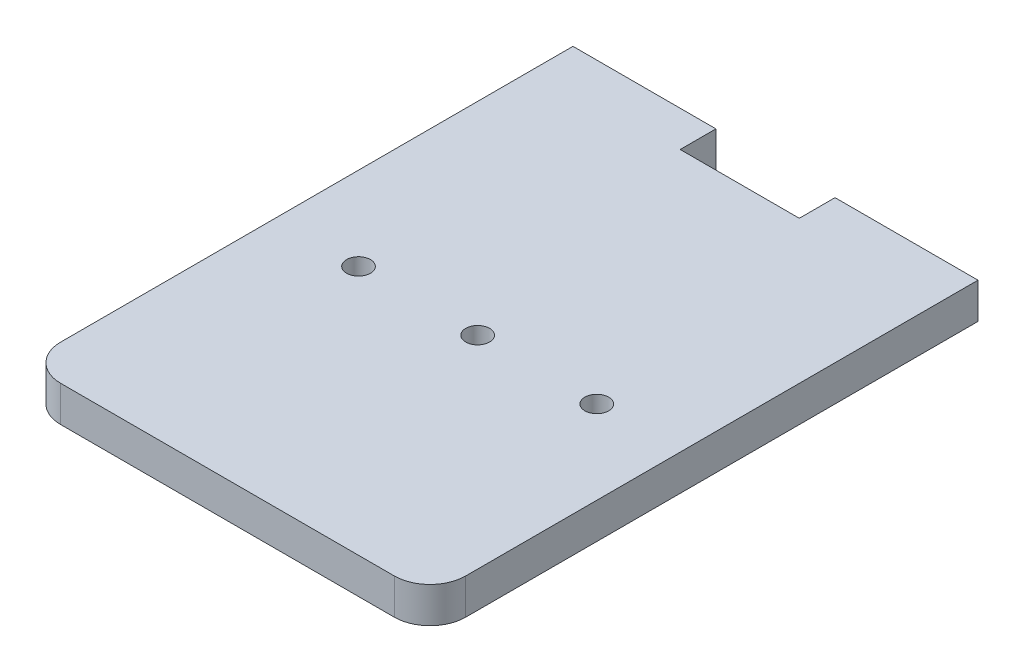
ISO-10303-21;
HEADER;
FILE_DESCRIPTION(('STEP AP214'),'2;1');
FILE_NAME('part.step','',(''),(''),'','','');
FILE_SCHEMA(('AUTOMOTIVE_DESIGN { 1 0 10303 214 1 1 1 1 }'));
ENDSEC;
DATA;
#1=APPLICATION_CONTEXT('core data for automotive mechanical design processes');
#2=APPLICATION_PROTOCOL_DEFINITION('international standard','automotive_design',2000,#1);
#3=PRODUCT_CONTEXT('',#1,'mechanical');
#4=PRODUCT('Part','Part','',(#3));
#5=PRODUCT_RELATED_PRODUCT_CATEGORY('part','',(#4));
#6=PRODUCT_DEFINITION_FORMATION('','',#4);
#7=PRODUCT_DEFINITION_CONTEXT('part definition',#1,'design');
#8=PRODUCT_DEFINITION('design','',#6,#7);
#9=PRODUCT_DEFINITION_SHAPE('','',#8);
#10=(LENGTH_UNIT() NAMED_UNIT(*) SI_UNIT(.MILLI.,.METRE.));
#11=(NAMED_UNIT(*) PLANE_ANGLE_UNIT() SI_UNIT($,.RADIAN.));
#12=(NAMED_UNIT(*) SI_UNIT($,.STERADIAN.) SOLID_ANGLE_UNIT());
#13=UNCERTAINTY_MEASURE_WITH_UNIT(LENGTH_MEASURE(1.E-05),#10,'distance_accuracy_value','');
#14=(GEOMETRIC_REPRESENTATION_CONTEXT(3) GLOBAL_UNCERTAINTY_ASSIGNED_CONTEXT((#13)) GLOBAL_UNIT_ASSIGNED_CONTEXT((#10,
#11,#12)) REPRESENTATION_CONTEXT('',''));
#15=CARTESIAN_POINT('',(0.,0.,0.));
#16=DIRECTION('',(0.,0.,1.));
#17=DIRECTION('',(1.,0.,0.));
#18=AXIS2_PLACEMENT_3D('',#15,#16,#17);
#19=CARTESIAN_POINT('',(14.,3.,-3.));
#20=DIRECTION('',(0.,1.,0.));
#21=DIRECTION('',(0.,0.,1.));
#22=AXIS2_PLACEMENT_3D('',#19,#20,#21);
#23=PLANE('',#22);
#24=CARTESIAN_POINT('',(-10.,3.,-21.));
#25=DIRECTION('',(0.,1.,0.));
#26=DIRECTION('',(0.,0.,1.));
#27=AXIS2_PLACEMENT_3D('',#24,#25,#26);
#28=CIRCLE('',#27,1.);
#29=CARTESIAN_POINT('',(-10.,3.,-20.));
#30=VERTEX_POINT('',#29);
#31=EDGE_CURVE('E212',#30,#30,#28,.T.);
#32=ORIENTED_EDGE('',*,*,#31,.F.);
#33=EDGE_LOOP('',(#32));
#34=FACE_BOUND('',#33,.T.);
#35=DIRECTION('',(-1.,0.,0.));
#36=VECTOR('',#35,1.);
#37=CARTESIAN_POINT('',(5.,3.,-46.));
#38=LINE('',#37,#36);
#39=CARTESIAN_POINT('',(17.,3.,-46.));
#40=VERTEX_POINT('',#39);
#41=CARTESIAN_POINT('',(5.,3.,-46.));
#42=VERTEX_POINT('',#41);
#43=EDGE_CURVE('E161',#40,#42,#38,.T.);
#44=ORIENTED_EDGE('',*,*,#43,.T.);
#45=DIRECTION('',(0.,0.,1.));
#46=VECTOR('',#45,1.);
#47=CARTESIAN_POINT('',(5.,3.,-43.));
#48=LINE('',#47,#46);
#49=CARTESIAN_POINT('',(5.,3.,-43.));
#50=VERTEX_POINT('',#49);
#51=EDGE_CURVE('E99',#42,#50,#48,.T.);
#52=ORIENTED_EDGE('',*,*,#51,.T.);
#53=DIRECTION('',(-1.,0.,0.));
#54=VECTOR('',#53,1.);
#55=CARTESIAN_POINT('',(-5.,3.,-43.));
#56=LINE('',#55,#54);
#57=CARTESIAN_POINT('',(-5.,3.,-43.));
#58=VERTEX_POINT('',#57);
#59=EDGE_CURVE('E182',#50,#58,#56,.T.);
#60=ORIENTED_EDGE('',*,*,#59,.T.);
#61=DIRECTION('',(0.,0.,-1.));
#62=VECTOR('',#61,1.);
#63=CARTESIAN_POINT('',(-5.,3.,-46.));
#64=LINE('',#63,#62);
#65=CARTESIAN_POINT('',(-5.,3.,-46.));
#66=VERTEX_POINT('',#65);
#67=EDGE_CURVE('E201',#58,#66,#64,.T.);
#68=ORIENTED_EDGE('',*,*,#67,.T.);
#69=DIRECTION('',(-1.,0.,0.));
#70=VECTOR('',#69,1.);
#71=CARTESIAN_POINT('',(-17.,3.,-46.));
#72=LINE('',#71,#70);
#73=CARTESIAN_POINT('',(-17.,3.,-46.));
#74=VERTEX_POINT('',#73);
#75=EDGE_CURVE('E198',#66,#74,#72,.T.);
#76=ORIENTED_EDGE('',*,*,#75,.T.);
#77=DIRECTION('',(0.,0.,1.));
#78=VECTOR('',#77,1.);
#79=CARTESIAN_POINT('',(-17.,3.,-3.));
#80=LINE('',#79,#78);
#81=CARTESIAN_POINT('',(-17.,3.,-3.));
#82=VERTEX_POINT('',#81);
#83=EDGE_CURVE('E200',#74,#82,#80,.T.);
#84=ORIENTED_EDGE('',*,*,#83,.T.);
#85=CARTESIAN_POINT('',(-14.,3.,-3.));
#86=DIRECTION('',(0.,1.,0.));
#87=DIRECTION('',(0.,0.,-1.));
#88=AXIS2_PLACEMENT_3D('',#85,#86,#87);
#89=CIRCLE('',#88,3.);
#90=CARTESIAN_POINT('',(-14.,3.,0.));
#91=VERTEX_POINT('',#90);
#92=EDGE_CURVE('E124',#82,#91,#89,.T.);
#93=ORIENTED_EDGE('',*,*,#92,.T.);
#94=DIRECTION('',(1.,0.,0.));
#95=VECTOR('',#94,1.);
#96=CARTESIAN_POINT('',(-14.,3.,0.));
#97=LINE('',#96,#95);
#98=CARTESIAN_POINT('',(14.,3.,0.));
#99=VERTEX_POINT('',#98);
#100=EDGE_CURVE('E118',#91,#99,#97,.T.);
#101=ORIENTED_EDGE('',*,*,#100,.T.);
#102=CARTESIAN_POINT('',(14.,3.,-3.));
#103=DIRECTION('',(0.,1.,0.));
#104=DIRECTION('',(0.,0.,1.));
#105=AXIS2_PLACEMENT_3D('',#102,#103,#104);
#106=CIRCLE('',#105,3.);
#107=CARTESIAN_POINT('',(17.,3.,-3.));
#108=VERTEX_POINT('',#107);
#109=EDGE_CURVE('E122',#99,#108,#106,.T.);
#110=ORIENTED_EDGE('',*,*,#109,.T.);
#111=DIRECTION('',(0.,0.,-1.));
#112=VECTOR('',#111,1.);
#113=CARTESIAN_POINT('',(17.,3.,-3.));
#114=LINE('',#113,#112);
#115=EDGE_CURVE('E50',#108,#40,#114,.T.);
#116=ORIENTED_EDGE('',*,*,#115,.T.);
#117=EDGE_LOOP('',(#44,#52,#60,#68,#76,#84,#93,#101,#110,#116));
#118=FACE_BOUND('',#117,.T.);
#119=CARTESIAN_POINT('',(0.,3.,-21.));
#120=DIRECTION('',(0.,1.,0.));
#121=DIRECTION('',(0.,0.,1.));
#122=AXIS2_PLACEMENT_3D('',#119,#120,#121);
#123=CIRCLE('',#122,1.);
#124=CARTESIAN_POINT('',(0.,3.,-20.));
#125=VERTEX_POINT('',#124);
#126=EDGE_CURVE('E146',#125,#125,#123,.T.);
#127=ORIENTED_EDGE('',*,*,#126,.F.);
#128=EDGE_LOOP('',(#127));
#129=FACE_BOUND('',#128,.T.);
#130=CARTESIAN_POINT('',(10.,3.,-21.));
#131=DIRECTION('',(0.,1.,0.));
#132=DIRECTION('',(0.,0.,1.));
#133=AXIS2_PLACEMENT_3D('',#130,#131,#132);
#134=CIRCLE('',#133,1.);
#135=CARTESIAN_POINT('',(10.,3.,-20.));
#136=VERTEX_POINT('',#135);
#137=EDGE_CURVE('E218',#136,#136,#134,.T.);
#138=ORIENTED_EDGE('',*,*,#137,.F.);
#139=EDGE_LOOP('',(#138));
#140=FACE_BOUND('',#139,.T.);
#141=ADVANCED_FACE('F33',(#34,#118,#129,#140),#23,.T.);
#142=CARTESIAN_POINT('',(14.,0.,-3.));
#143=DIRECTION('',(0.,1.,0.));
#144=DIRECTION('',(0.,0.,1.));
#145=AXIS2_PLACEMENT_3D('',#142,#143,#144);
#146=PLANE('',#145);
#147=DIRECTION('',(-1.,0.,0.));
#148=VECTOR('',#147,1.);
#149=CARTESIAN_POINT('',(5.,0.,-46.));
#150=LINE('',#149,#148);
#151=CARTESIAN_POINT('',(17.,0.,-46.));
#152=VERTEX_POINT('',#151);
#153=CARTESIAN_POINT('',(5.,0.,-46.));
#154=VERTEX_POINT('',#153);
#155=EDGE_CURVE('E142',#152,#154,#150,.T.);
#156=ORIENTED_EDGE('',*,*,#155,.F.);
#157=DIRECTION('',(0.,0.,-1.));
#158=VECTOR('',#157,1.);
#159=CARTESIAN_POINT('',(17.,0.,-3.));
#160=LINE('',#159,#158);
#161=CARTESIAN_POINT('',(17.,0.,-3.));
#162=VERTEX_POINT('',#161);
#163=EDGE_CURVE('E91',#162,#152,#160,.T.);
#164=ORIENTED_EDGE('',*,*,#163,.F.);
#165=CARTESIAN_POINT('',(14.,0.,-3.));
#166=DIRECTION('',(0.,1.,0.));
#167=DIRECTION('',(0.,0.,1.));
#168=AXIS2_PLACEMENT_3D('',#165,#166,#167);
#169=CIRCLE('',#168,3.);
#170=CARTESIAN_POINT('',(14.,0.,0.));
#171=VERTEX_POINT('',#170);
#172=EDGE_CURVE('E85',#171,#162,#169,.T.);
#173=ORIENTED_EDGE('',*,*,#172,.F.);
#174=DIRECTION('',(1.,0.,0.));
#175=VECTOR('',#174,1.);
#176=CARTESIAN_POINT('',(-14.,0.,0.));
#177=LINE('',#176,#175);
#178=CARTESIAN_POINT('',(-14.,0.,0.));
#179=VERTEX_POINT('',#178);
#180=EDGE_CURVE('E132',#179,#171,#177,.T.);
#181=ORIENTED_EDGE('',*,*,#180,.F.);
#182=CARTESIAN_POINT('',(-14.,0.,-3.));
#183=DIRECTION('',(0.,1.,0.));
#184=DIRECTION('',(0.,0.,-1.));
#185=AXIS2_PLACEMENT_3D('',#182,#183,#184);
#186=CIRCLE('',#185,3.);
#187=CARTESIAN_POINT('',(-17.,0.,-3.));
#188=VERTEX_POINT('',#187);
#189=EDGE_CURVE('E156',#188,#179,#186,.T.);
#190=ORIENTED_EDGE('',*,*,#189,.F.);
#191=DIRECTION('',(0.,0.,1.));
#192=VECTOR('',#191,1.);
#193=CARTESIAN_POINT('',(-17.,0.,-3.));
#194=LINE('',#193,#192);
#195=CARTESIAN_POINT('',(-17.,0.,-46.));
#196=VERTEX_POINT('',#195);
#197=EDGE_CURVE('E154',#196,#188,#194,.T.);
#198=ORIENTED_EDGE('',*,*,#197,.F.);
#199=DIRECTION('',(-1.,0.,0.));
#200=VECTOR('',#199,1.);
#201=CARTESIAN_POINT('',(-17.,0.,-46.));
#202=LINE('',#201,#200);
#203=CARTESIAN_POINT('',(-5.,0.,-46.));
#204=VERTEX_POINT('',#203);
#205=EDGE_CURVE('E152',#204,#196,#202,.T.);
#206=ORIENTED_EDGE('',*,*,#205,.F.);
#207=DIRECTION('',(0.,0.,-1.));
#208=VECTOR('',#207,1.);
#209=CARTESIAN_POINT('',(-5.,0.,-46.));
#210=LINE('',#209,#208);
#211=CARTESIAN_POINT('',(-5.,0.,-43.));
#212=VERTEX_POINT('',#211);
#213=EDGE_CURVE('E150',#212,#204,#210,.T.);
#214=ORIENTED_EDGE('',*,*,#213,.F.);
#215=DIRECTION('',(-1.,0.,0.));
#216=VECTOR('',#215,1.);
#217=CARTESIAN_POINT('',(-5.,0.,-43.));
#218=LINE('',#217,#216);
#219=CARTESIAN_POINT('',(5.,0.,-43.));
#220=VERTEX_POINT('',#219);
#221=EDGE_CURVE('E148',#220,#212,#218,.T.);
#222=ORIENTED_EDGE('',*,*,#221,.F.);
#223=DIRECTION('',(0.,0.,1.));
#224=VECTOR('',#223,1.);
#225=CARTESIAN_POINT('',(5.,0.,-43.));
#226=LINE('',#225,#224);
#227=EDGE_CURVE('E145',#154,#220,#226,.T.);
#228=ORIENTED_EDGE('',*,*,#227,.F.);
#229=EDGE_LOOP('',(#156,#164,#173,#181,#190,#198,#206,#214,#222,#228));
#230=FACE_BOUND('',#229,.T.);
#231=CARTESIAN_POINT('',(0.,0.,-21.));
#232=DIRECTION('',(0.,1.,0.));
#233=DIRECTION('',(0.,0.,1.));
#234=AXIS2_PLACEMENT_3D('',#231,#232,#233);
#235=CIRCLE('',#234,1.);
#236=CARTESIAN_POINT('',(0.,0.,-20.));
#237=VERTEX_POINT('',#236);
#238=EDGE_CURVE('E209',#237,#237,#235,.T.);
#239=ORIENTED_EDGE('',*,*,#238,.T.);
#240=EDGE_LOOP('',(#239));
#241=FACE_BOUND('',#240,.T.);
#242=CARTESIAN_POINT('',(-10.,0.,-21.));
#243=DIRECTION('',(0.,1.,0.));
#244=DIRECTION('',(0.,0.,1.));
#245=AXIS2_PLACEMENT_3D('',#242,#243,#244);
#246=CIRCLE('',#245,1.);
#247=CARTESIAN_POINT('',(-10.,0.,-20.));
#248=VERTEX_POINT('',#247);
#249=EDGE_CURVE('E215',#248,#248,#246,.T.);
#250=ORIENTED_EDGE('',*,*,#249,.T.);
#251=EDGE_LOOP('',(#250));
#252=FACE_BOUND('',#251,.T.);
#253=CARTESIAN_POINT('',(10.,0.,-21.));
#254=DIRECTION('',(0.,1.,0.));
#255=DIRECTION('',(0.,0.,1.));
#256=AXIS2_PLACEMENT_3D('',#253,#254,#255);
#257=CIRCLE('',#256,1.);
#258=CARTESIAN_POINT('',(10.,0.,-20.));
#259=VERTEX_POINT('',#258);
#260=EDGE_CURVE('E221',#259,#259,#257,.T.);
#261=ORIENTED_EDGE('',*,*,#260,.T.);
#262=EDGE_LOOP('',(#261));
#263=FACE_BOUND('',#262,.T.);
#264=ADVANCED_FACE('F186',(#230,#241,#252,#263),#146,.F.);
#265=CARTESIAN_POINT('',(5.,3.,-46.));
#266=DIRECTION('',(0.,0.,1.));
#267=DIRECTION('',(1.,0.,0.));
#268=AXIS2_PLACEMENT_3D('',#265,#266,#267);
#269=PLANE('',#268);
#270=ORIENTED_EDGE('',*,*,#155,.T.);
#271=DIRECTION('',(0.,-1.,0.));
#272=VECTOR('',#271,1.);
#273=CARTESIAN_POINT('',(5.,3.,-46.));
#274=LINE('',#273,#272);
#275=EDGE_CURVE('E11',#42,#154,#274,.T.);
#276=ORIENTED_EDGE('',*,*,#275,.F.);
#277=ORIENTED_EDGE('',*,*,#43,.F.);
#278=DIRECTION('',(0.,-1.,0.));
#279=VECTOR('',#278,1.);
#280=CARTESIAN_POINT('',(17.,3.,-46.));
#281=LINE('',#280,#279);
#282=EDGE_CURVE('E138',#40,#152,#281,.T.);
#283=ORIENTED_EDGE('',*,*,#282,.T.);
#284=EDGE_LOOP('',(#270,#276,#277,#283));
#285=FACE_BOUND('',#284,.T.);
#286=ADVANCED_FACE('F35',(#285),#269,.F.);
#287=CARTESIAN_POINT('',(5.,3.,-43.));
#288=DIRECTION('',(1.,0.,0.));
#289=DIRECTION('',(0.,0.,-1.));
#290=AXIS2_PLACEMENT_3D('',#287,#288,#289);
#291=PLANE('',#290);
#292=ORIENTED_EDGE('',*,*,#227,.T.);
#293=DIRECTION('',(0.,-1.,0.));
#294=VECTOR('',#293,1.);
#295=CARTESIAN_POINT('',(5.,3.,-43.));
#296=LINE('',#295,#294);
#297=EDGE_CURVE('E42',#50,#220,#296,.T.);
#298=ORIENTED_EDGE('',*,*,#297,.F.);
#299=ORIENTED_EDGE('',*,*,#51,.F.);
#300=ORIENTED_EDGE('',*,*,#275,.T.);
#301=EDGE_LOOP('',(#292,#298,#299,#300));
#302=FACE_BOUND('',#301,.T.);
#303=ADVANCED_FACE('F262',(#302),#291,.F.);
#304=CARTESIAN_POINT('',(-5.,3.,-43.));
#305=DIRECTION('',(0.,0.,1.));
#306=DIRECTION('',(1.,0.,0.));
#307=AXIS2_PLACEMENT_3D('',#304,#305,#306);
#308=PLANE('',#307);
#309=ORIENTED_EDGE('',*,*,#221,.T.);
#310=DIRECTION('',(0.,-1.,0.));
#311=VECTOR('',#310,1.);
#312=CARTESIAN_POINT('',(-5.,3.,-43.));
#313=LINE('',#312,#311);
#314=EDGE_CURVE('E174',#58,#212,#313,.T.);
#315=ORIENTED_EDGE('',*,*,#314,.F.);
#316=ORIENTED_EDGE('',*,*,#59,.F.);
#317=ORIENTED_EDGE('',*,*,#297,.T.);
#318=EDGE_LOOP('',(#309,#315,#316,#317));
#319=FACE_BOUND('',#318,.T.);
#320=ADVANCED_FACE('F180',(#319),#308,.F.);
#321=CARTESIAN_POINT('',(-5.,3.,-46.));
#322=DIRECTION('',(-1.,0.,0.));
#323=DIRECTION('',(0.,0.,1.));
#324=AXIS2_PLACEMENT_3D('',#321,#322,#323);
#325=PLANE('',#324);
#326=ORIENTED_EDGE('',*,*,#213,.T.);
#327=DIRECTION('',(0.,-1.,0.));
#328=VECTOR('',#327,1.);
#329=CARTESIAN_POINT('',(-5.,3.,-46.));
#330=LINE('',#329,#328);
#331=EDGE_CURVE('E171',#66,#204,#330,.T.);
#332=ORIENTED_EDGE('',*,*,#331,.F.);
#333=ORIENTED_EDGE('',*,*,#67,.F.);
#334=ORIENTED_EDGE('',*,*,#314,.T.);
#335=EDGE_LOOP('',(#326,#332,#333,#334));
#336=FACE_BOUND('',#335,.T.);
#337=ADVANCED_FACE('F192',(#336),#325,.F.);
#338=CARTESIAN_POINT('',(-17.,3.,-46.));
#339=DIRECTION('',(0.,0.,1.));
#340=DIRECTION('',(1.,0.,0.));
#341=AXIS2_PLACEMENT_3D('',#338,#339,#340);
#342=PLANE('',#341);
#343=ORIENTED_EDGE('',*,*,#205,.T.);
#344=DIRECTION('',(0.,-1.,0.));
#345=VECTOR('',#344,1.);
#346=CARTESIAN_POINT('',(-17.,3.,-46.));
#347=LINE('',#346,#345);
#348=EDGE_CURVE('E168',#74,#196,#347,.T.);
#349=ORIENTED_EDGE('',*,*,#348,.F.);
#350=ORIENTED_EDGE('',*,*,#75,.F.);
#351=ORIENTED_EDGE('',*,*,#331,.T.);
#352=EDGE_LOOP('',(#343,#349,#350,#351));
#353=FACE_BOUND('',#352,.T.);
#354=ADVANCED_FACE('F196',(#353),#342,.F.);
#355=CARTESIAN_POINT('',(-17.,3.,-3.));
#356=DIRECTION('',(1.,0.,0.));
#357=DIRECTION('',(0.,0.,-1.));
#358=AXIS2_PLACEMENT_3D('',#355,#356,#357);
#359=PLANE('',#358);
#360=ORIENTED_EDGE('',*,*,#197,.T.);
#361=DIRECTION('',(0.,-1.,0.));
#362=VECTOR('',#361,1.);
#363=CARTESIAN_POINT('',(-17.,3.,-3.));
#364=LINE('',#363,#362);
#365=EDGE_CURVE('E165',#82,#188,#364,.T.);
#366=ORIENTED_EDGE('',*,*,#365,.F.);
#367=ORIENTED_EDGE('',*,*,#83,.F.);
#368=ORIENTED_EDGE('',*,*,#348,.T.);
#369=EDGE_LOOP('',(#360,#366,#367,#368));
#370=FACE_BOUND('',#369,.T.);
#371=ADVANCED_FACE('F252',(#370),#359,.F.);
#372=CARTESIAN_POINT('',(-14.,3.,-3.));
#373=DIRECTION('',(0.,-1.,0.));
#374=DIRECTION('',(0.,0.,-1.));
#375=AXIS2_PLACEMENT_3D('',#372,#373,#374);
#376=CYLINDRICAL_SURFACE('',#375,3.);
#377=ORIENTED_EDGE('',*,*,#189,.T.);
#378=DIRECTION('',(0.,-1.,0.));
#379=VECTOR('',#378,1.);
#380=CARTESIAN_POINT('',(-14.,3.,0.));
#381=LINE('',#380,#379);
#382=EDGE_CURVE('E133',#91,#179,#381,.T.);
#383=ORIENTED_EDGE('',*,*,#382,.F.);
#384=ORIENTED_EDGE('',*,*,#92,.F.);
#385=ORIENTED_EDGE('',*,*,#365,.T.);
#386=EDGE_LOOP('',(#377,#383,#384,#385));
#387=FACE_BOUND('',#386,.T.);
#388=ADVANCED_FACE('F249',(#387),#376,.T.);
#389=CARTESIAN_POINT('',(-14.,3.,0.));
#390=DIRECTION('',(0.,0.,-1.));
#391=DIRECTION('',(-1.,0.,0.));
#392=AXIS2_PLACEMENT_3D('',#389,#390,#391);
#393=PLANE('',#392);
#394=ORIENTED_EDGE('',*,*,#180,.T.);
#395=DIRECTION('',(0.,-1.,0.));
#396=VECTOR('',#395,1.);
#397=CARTESIAN_POINT('',(14.,3.,0.));
#398=LINE('',#397,#396);
#399=EDGE_CURVE('E129',#99,#171,#398,.T.);
#400=ORIENTED_EDGE('',*,*,#399,.F.);
#401=ORIENTED_EDGE('',*,*,#100,.F.);
#402=ORIENTED_EDGE('',*,*,#382,.T.);
#403=EDGE_LOOP('',(#394,#400,#401,#402));
#404=FACE_BOUND('',#403,.T.);
#405=ADVANCED_FACE('F130',(#404),#393,.F.);
#406=CARTESIAN_POINT('',(14.,3.,-3.));
#407=DIRECTION('',(0.,-1.,0.));
#408=DIRECTION('',(0.,0.,-1.));
#409=AXIS2_PLACEMENT_3D('',#406,#407,#408);
#410=CYLINDRICAL_SURFACE('',#409,3.);
#411=ORIENTED_EDGE('',*,*,#172,.T.);
#412=DIRECTION('',(0.,-1.,0.));
#413=VECTOR('',#412,1.);
#414=CARTESIAN_POINT('',(17.,3.,-3.));
#415=LINE('',#414,#413);
#416=EDGE_CURVE('E134',#108,#162,#415,.T.);
#417=ORIENTED_EDGE('',*,*,#416,.F.);
#418=ORIENTED_EDGE('',*,*,#109,.F.);
#419=ORIENTED_EDGE('',*,*,#399,.T.);
#420=EDGE_LOOP('',(#411,#417,#418,#419));
#421=FACE_BOUND('',#420,.T.);
#422=ADVANCED_FACE('F136',(#421),#410,.T.);
#423=CARTESIAN_POINT('',(17.,3.,-3.));
#424=DIRECTION('',(-1.,0.,0.));
#425=DIRECTION('',(0.,0.,1.));
#426=AXIS2_PLACEMENT_3D('',#423,#424,#425);
#427=PLANE('',#426);
#428=ORIENTED_EDGE('',*,*,#163,.T.);
#429=ORIENTED_EDGE('',*,*,#282,.F.);
#430=ORIENTED_EDGE('',*,*,#115,.F.);
#431=ORIENTED_EDGE('',*,*,#416,.T.);
#432=EDGE_LOOP('',(#428,#429,#430,#431));
#433=FACE_BOUND('',#432,.T.);
#434=ADVANCED_FACE('F242',(#433),#427,.F.);
#435=CARTESIAN_POINT('',(0.,3.,-21.));
#436=DIRECTION('',(0.,-1.,0.));
#437=DIRECTION('',(0.,0.,-1.));
#438=AXIS2_PLACEMENT_3D('',#435,#436,#437);
#439=CYLINDRICAL_SURFACE('',#438,1.);
#440=ORIENTED_EDGE('',*,*,#126,.T.);
#441=EDGE_LOOP('',(#440));
#442=FACE_BOUND('',#441,.T.);
#443=ORIENTED_EDGE('',*,*,#238,.F.);
#444=EDGE_LOOP('',(#443));
#445=FACE_BOUND('',#444,.T.);
#446=ADVANCED_FACE('F239',(#442,#445),#439,.F.);
#447=CARTESIAN_POINT('',(-10.,3.,-21.));
#448=DIRECTION('',(0.,-1.,0.));
#449=DIRECTION('',(0.,0.,-1.));
#450=AXIS2_PLACEMENT_3D('',#447,#448,#449);
#451=CYLINDRICAL_SURFACE('',#450,1.);
#452=ORIENTED_EDGE('',*,*,#31,.T.);
#453=EDGE_LOOP('',(#452));
#454=FACE_BOUND('',#453,.T.);
#455=ORIENTED_EDGE('',*,*,#249,.F.);
#456=EDGE_LOOP('',(#455));
#457=FACE_BOUND('',#456,.T.);
#458=ADVANCED_FACE('F338',(#454,#457),#451,.F.);
#459=CARTESIAN_POINT('',(10.,3.,-21.));
#460=DIRECTION('',(0.,-1.,0.));
#461=DIRECTION('',(0.,0.,-1.));
#462=AXIS2_PLACEMENT_3D('',#459,#460,#461);
#463=CYLINDRICAL_SURFACE('',#462,1.);
#464=ORIENTED_EDGE('',*,*,#137,.T.);
#465=EDGE_LOOP('',(#464));
#466=FACE_BOUND('',#465,.T.);
#467=ORIENTED_EDGE('',*,*,#260,.F.);
#468=EDGE_LOOP('',(#467));
#469=FACE_BOUND('',#468,.T.);
#470=ADVANCED_FACE('F227',(#466,#469),#463,.F.);
#471=CLOSED_SHELL('',(#141,#264,#286,#303,#320,#337,#354,#371,#388,#405,#422,#434,#446,#458,#470));
#472=MANIFOLD_SOLID_BREP('B2',#471);
#473=ADVANCED_BREP_SHAPE_REPRESENTATION('',(#18,#472),#14);
#474=SHAPE_DEFINITION_REPRESENTATION(#9,#473);
ENDSEC;
END-ISO-10303-21;
